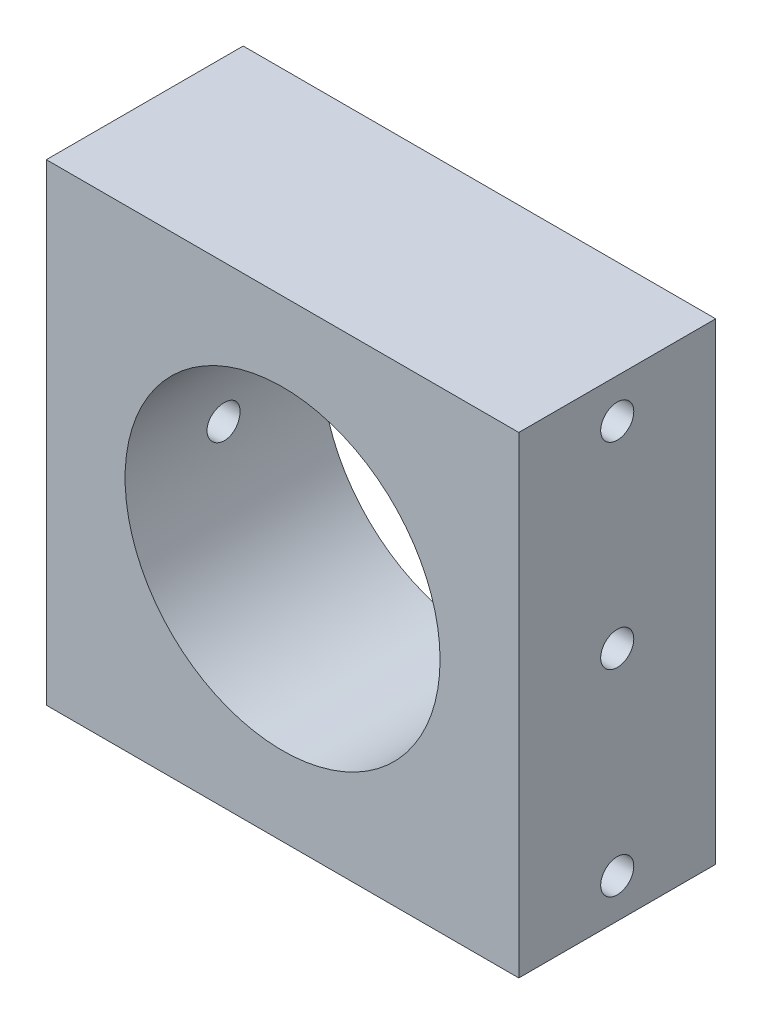
ISO-10303-21;
HEADER;
FILE_DESCRIPTION(('STEP AP214'),'2;1');
FILE_NAME('part.step','',(''),(''),'','','');
FILE_SCHEMA(('AUTOMOTIVE_DESIGN { 1 0 10303 214 1 1 1 1 }'));
ENDSEC;
DATA;
#1=APPLICATION_CONTEXT('core data for automotive mechanical design processes');
#2=APPLICATION_PROTOCOL_DEFINITION('international standard','automotive_design',2000,#1);
#3=PRODUCT_CONTEXT('',#1,'mechanical');
#4=PRODUCT('Part','Part','',(#3));
#5=PRODUCT_RELATED_PRODUCT_CATEGORY('part','',(#4));
#6=PRODUCT_DEFINITION_FORMATION('','',#4);
#7=PRODUCT_DEFINITION_CONTEXT('part definition',#1,'design');
#8=PRODUCT_DEFINITION('design','',#6,#7);
#9=PRODUCT_DEFINITION_SHAPE('','',#8);
#10=(LENGTH_UNIT() NAMED_UNIT(*) SI_UNIT(.MILLI.,.METRE.));
#11=(NAMED_UNIT(*) PLANE_ANGLE_UNIT() SI_UNIT($,.RADIAN.));
#12=(NAMED_UNIT(*) SI_UNIT($,.STERADIAN.) SOLID_ANGLE_UNIT());
#13=UNCERTAINTY_MEASURE_WITH_UNIT(LENGTH_MEASURE(1.E-05),#10,'distance_accuracy_value','');
#14=(GEOMETRIC_REPRESENTATION_CONTEXT(3) GLOBAL_UNCERTAINTY_ASSIGNED_CONTEXT((#13)) GLOBAL_UNIT_ASSIGNED_CONTEXT((#10,
#11,#12)) REPRESENTATION_CONTEXT('',''));
#15=CARTESIAN_POINT('',(0.,0.,0.));
#16=DIRECTION('',(0.,0.,1.));
#17=DIRECTION('',(1.,0.,0.));
#18=AXIS2_PLACEMENT_3D('',#15,#16,#17);
#19=CARTESIAN_POINT('',(0.,-30.,25.));
#20=DIRECTION('',(0.,1.,0.));
#21=DIRECTION('',(0.,0.,1.));
#22=AXIS2_PLACEMENT_3D('',#19,#20,#21);
#23=PLANE('',#22);
#24=DIRECTION('',(1.,0.,0.));
#25=VECTOR('',#24,1.);
#26=CARTESIAN_POINT('',(0.,-30.,0.));
#27=LINE('',#26,#25);
#28=CARTESIAN_POINT('',(-30.,-30.,0.));
#29=VERTEX_POINT('',#28);
#30=CARTESIAN_POINT('',(30.,-30.,0.));
#31=VERTEX_POINT('',#30);
#32=EDGE_CURVE('E118',#29,#31,#27,.T.);
#33=ORIENTED_EDGE('',*,*,#32,.T.);
#34=DIRECTION('',(0.,0.,-1.));
#35=VECTOR('',#34,1.);
#36=CARTESIAN_POINT('',(30.,-30.,25.));
#37=LINE('',#36,#35);
#38=CARTESIAN_POINT('',(30.,-30.,25.));
#39=VERTEX_POINT('',#38);
#40=EDGE_CURVE('E11',#39,#31,#37,.T.);
#41=ORIENTED_EDGE('',*,*,#40,.F.);
#42=DIRECTION('',(1.,0.,0.));
#43=VECTOR('',#42,1.);
#44=CARTESIAN_POINT('',(0.,-30.,25.));
#45=LINE('',#44,#43);
#46=CARTESIAN_POINT('',(-30.,-30.,25.));
#47=VERTEX_POINT('',#46);
#48=EDGE_CURVE('E100',#47,#39,#45,.T.);
#49=ORIENTED_EDGE('',*,*,#48,.F.);
#50=DIRECTION('',(0.,0.,-1.));
#51=VECTOR('',#50,1.);
#52=CARTESIAN_POINT('',(-30.,-30.,25.));
#53=LINE('',#52,#51);
#54=EDGE_CURVE('E66',#47,#29,#53,.T.);
#55=ORIENTED_EDGE('',*,*,#54,.T.);
#56=EDGE_LOOP('',(#33,#41,#49,#55));
#57=FACE_BOUND('',#56,.T.);
#58=ADVANCED_FACE('F43',(#57),#23,.F.);
#59=CARTESIAN_POINT('',(30.,0.,25.));
#60=DIRECTION('',(-1.,0.,0.));
#61=DIRECTION('',(0.,0.,1.));
#62=AXIS2_PLACEMENT_3D('',#59,#60,#61);
#63=PLANE('',#62);
#64=CARTESIAN_POINT('',(30.,25.,12.5));
#65=DIRECTION('',(1.,0.,0.));
#66=DIRECTION('',(0.,0.,-1.));
#67=AXIS2_PLACEMENT_3D('',#64,#65,#66);
#68=CIRCLE('',#67,2.1);
#69=CARTESIAN_POINT('',(30.,25.,10.4));
#70=VERTEX_POINT('',#69);
#71=EDGE_CURVE('E191',#70,#70,#68,.T.);
#72=ORIENTED_EDGE('',*,*,#71,.F.);
#73=EDGE_LOOP('',(#72));
#74=FACE_BOUND('',#73,.T.);
#75=CARTESIAN_POINT('',(30.,-25.,12.5));
#76=DIRECTION('',(1.,0.,0.));
#77=DIRECTION('',(0.,0.,-1.));
#78=AXIS2_PLACEMENT_3D('',#75,#76,#77);
#79=CIRCLE('',#78,2.1);
#80=CARTESIAN_POINT('',(30.,-25.,10.4));
#81=VERTEX_POINT('',#80);
#82=EDGE_CURVE('E188',#81,#81,#79,.T.);
#83=ORIENTED_EDGE('',*,*,#82,.F.);
#84=EDGE_LOOP('',(#83));
#85=FACE_BOUND('',#84,.T.);
#86=CARTESIAN_POINT('',(30.,0.,12.5));
#87=DIRECTION('',(1.,0.,0.));
#88=DIRECTION('',(0.,0.,-1.));
#89=AXIS2_PLACEMENT_3D('',#86,#87,#88);
#90=CIRCLE('',#89,2.1);
#91=CARTESIAN_POINT('',(30.,0.,10.4));
#92=VERTEX_POINT('',#91);
#93=EDGE_CURVE('E182',#92,#92,#90,.T.);
#94=ORIENTED_EDGE('',*,*,#93,.F.);
#95=EDGE_LOOP('',(#94));
#96=FACE_BOUND('',#95,.T.);
#97=DIRECTION('',(0.,1.,0.));
#98=VECTOR('',#97,1.);
#99=CARTESIAN_POINT('',(30.,0.,0.));
#100=LINE('',#99,#98);
#101=CARTESIAN_POINT('',(30.,30.,0.));
#102=VERTEX_POINT('',#101);
#103=EDGE_CURVE('E105',#31,#102,#100,.T.);
#104=ORIENTED_EDGE('',*,*,#103,.T.);
#105=DIRECTION('',(0.,0.,-1.));
#106=VECTOR('',#105,1.);
#107=CARTESIAN_POINT('',(30.,30.,25.));
#108=LINE('',#107,#106);
#109=CARTESIAN_POINT('',(30.,30.,25.));
#110=VERTEX_POINT('',#109);
#111=EDGE_CURVE('E57',#110,#102,#108,.T.);
#112=ORIENTED_EDGE('',*,*,#111,.F.);
#113=DIRECTION('',(0.,1.,0.));
#114=VECTOR('',#113,1.);
#115=CARTESIAN_POINT('',(30.,0.,25.));
#116=LINE('',#115,#114);
#117=EDGE_CURVE('E91',#39,#110,#116,.T.);
#118=ORIENTED_EDGE('',*,*,#117,.F.);
#119=ORIENTED_EDGE('',*,*,#40,.T.);
#120=EDGE_LOOP('',(#104,#112,#118,#119));
#121=FACE_BOUND('',#120,.T.);
#122=ADVANCED_FACE('F104',(#74,#85,#96,#121),#63,.F.);
#123=CARTESIAN_POINT('',(0.,30.,25.));
#124=DIRECTION('',(0.,1.,0.));
#125=DIRECTION('',(0.,0.,1.));
#126=AXIS2_PLACEMENT_3D('',#123,#124,#125);
#127=PLANE('',#126);
#128=DIRECTION('',(1.,0.,0.));
#129=VECTOR('',#128,1.);
#130=CARTESIAN_POINT('',(0.,30.,0.));
#131=LINE('',#130,#129);
#132=CARTESIAN_POINT('',(-30.,30.,0.));
#133=VERTEX_POINT('',#132);
#134=EDGE_CURVE('E121',#133,#102,#131,.T.);
#135=ORIENTED_EDGE('',*,*,#134,.F.);
#136=DIRECTION('',(0.,0.,-1.));
#137=VECTOR('',#136,1.);
#138=CARTESIAN_POINT('',(-30.,30.,25.));
#139=LINE('',#138,#137);
#140=CARTESIAN_POINT('',(-30.,30.,25.));
#141=VERTEX_POINT('',#140);
#142=EDGE_CURVE('E80',#141,#133,#139,.T.);
#143=ORIENTED_EDGE('',*,*,#142,.F.);
#144=DIRECTION('',(1.,0.,0.));
#145=VECTOR('',#144,1.);
#146=CARTESIAN_POINT('',(0.,30.,25.));
#147=LINE('',#146,#145);
#148=EDGE_CURVE('E99',#141,#110,#147,.T.);
#149=ORIENTED_EDGE('',*,*,#148,.T.);
#150=ORIENTED_EDGE('',*,*,#111,.T.);
#151=EDGE_LOOP('',(#135,#143,#149,#150));
#152=FACE_BOUND('',#151,.T.);
#153=ADVANCED_FACE('F109',(#152),#127,.T.);
#154=CARTESIAN_POINT('',(-30.,0.,25.));
#155=DIRECTION('',(-1.,0.,0.));
#156=DIRECTION('',(0.,0.,1.));
#157=AXIS2_PLACEMENT_3D('',#154,#155,#156);
#158=PLANE('',#157);
#159=CARTESIAN_POINT('',(-30.,25.,12.5));
#160=DIRECTION('',(1.,0.,0.));
#161=DIRECTION('',(0.,0.,-1.));
#162=AXIS2_PLACEMENT_3D('',#159,#160,#161);
#163=CIRCLE('',#162,2.1);
#164=CARTESIAN_POINT('',(-30.,25.,10.4));
#165=VERTEX_POINT('',#164);
#166=EDGE_CURVE('E135',#165,#165,#163,.T.);
#167=ORIENTED_EDGE('',*,*,#166,.T.);
#168=EDGE_LOOP('',(#167));
#169=FACE_BOUND('',#168,.T.);
#170=CARTESIAN_POINT('',(-30.,-25.,12.5));
#171=DIRECTION('',(1.,0.,0.));
#172=DIRECTION('',(0.,0.,-1.));
#173=AXIS2_PLACEMENT_3D('',#170,#171,#172);
#174=CIRCLE('',#173,2.1);
#175=CARTESIAN_POINT('',(-30.,-25.,10.4));
#176=VERTEX_POINT('',#175);
#177=EDGE_CURVE('E177',#176,#176,#174,.T.);
#178=ORIENTED_EDGE('',*,*,#177,.T.);
#179=EDGE_LOOP('',(#178));
#180=FACE_BOUND('',#179,.T.);
#181=CARTESIAN_POINT('',(-30.,0.,12.5));
#182=DIRECTION('',(1.,0.,0.));
#183=DIRECTION('',(0.,0.,-1.));
#184=AXIS2_PLACEMENT_3D('',#181,#182,#183);
#185=CIRCLE('',#184,2.1);
#186=CARTESIAN_POINT('',(-30.,0.,10.4));
#187=VERTEX_POINT('',#186);
#188=EDGE_CURVE('E180',#187,#187,#185,.T.);
#189=ORIENTED_EDGE('',*,*,#188,.T.);
#190=EDGE_LOOP('',(#189));
#191=FACE_BOUND('',#190,.T.);
#192=DIRECTION('',(0.,1.,0.));
#193=VECTOR('',#192,1.);
#194=CARTESIAN_POINT('',(-30.,0.,0.));
#195=LINE('',#194,#193);
#196=EDGE_CURVE('E123',#29,#133,#195,.T.);
#197=ORIENTED_EDGE('',*,*,#196,.F.);
#198=ORIENTED_EDGE('',*,*,#54,.F.);
#199=DIRECTION('',(0.,1.,0.));
#200=VECTOR('',#199,1.);
#201=CARTESIAN_POINT('',(-30.,0.,25.));
#202=LINE('',#201,#200);
#203=EDGE_CURVE('E110',#47,#141,#202,.T.);
#204=ORIENTED_EDGE('',*,*,#203,.T.);
#205=ORIENTED_EDGE('',*,*,#142,.T.);
#206=EDGE_LOOP('',(#197,#198,#204,#205));
#207=FACE_BOUND('',#206,.T.);
#208=ADVANCED_FACE('F163',(#169,#180,#191,#207),#158,.T.);
#209=CARTESIAN_POINT('',(0.,0.,25.));
#210=DIRECTION('',(0.,0.,-1.));
#211=DIRECTION('',(-1.,0.,0.));
#212=AXIS2_PLACEMENT_3D('',#209,#210,#211);
#213=CYLINDRICAL_SURFACE('',#212,20.);
#214=CARTESIAN_POINT('',(-20.,0.,14.6));
#215=CARTESIAN_POINT('',(-19.9999985861225,-0.117610574556953,14.5999949230642));
#216=CARTESIAN_POINT('',(-19.9989515701418,-0.235298131378431,14.5900865495256));
#217=CARTESIAN_POINT('',(-19.9948755007952,-0.467408281963046,14.5507109273298));
#218=CARTESIAN_POINT('',(-19.9918442846137,-0.581827170618682,14.52122233536));
#219=CARTESIAN_POINT('',(-19.9841418596598,-0.804005356961038,14.4435561221623));
#220=CARTESIAN_POINT('',(-19.9794716623513,-0.911768713849171,14.3953900254574));
#221=CARTESIAN_POINT('',(-19.9690129744413,-1.11765859904565,14.2817589762977));
#222=CARTESIAN_POINT('',(-19.963224700667,-1.2157869902952,14.2162973770353));
#223=CARTESIAN_POINT('',(-19.9511523144023,-1.40003175469819,14.069656435472));
#224=CARTESIAN_POINT('',(-19.9448665314529,-1.48610471828674,13.9884226842205));
#225=CARTESIAN_POINT('',(-19.9325213225088,-1.64342207671848,13.8126596136441));
#226=CARTESIAN_POINT('',(-19.9264619071801,-1.71466577354684,13.7181296688172));
#227=CARTESIAN_POINT('',(-19.915238578931,-1.84045763756347,13.5181837270879));
#228=CARTESIAN_POINT('',(-19.9100768004705,-1.89496624010398,13.4127427088117));
#229=CARTESIAN_POINT('',(-19.9012541874175,-1.98548798456523,13.1941409242799));
#230=CARTESIAN_POINT('',(-19.8975933121633,-2.02150162754854,13.080980367255));
#231=CARTESIAN_POINT('',(-19.8922022962288,-2.07388179744854,12.8505961431444));
#232=CARTESIAN_POINT('',(-19.890465054272,-2.09032060381389,12.7333890784955));
#233=CARTESIAN_POINT('',(-19.889096025595,-2.10330793490494,12.4978676604021));
#234=CARTESIAN_POINT('',(-19.8894641782095,-2.09985703273741,12.3795533389603));
#235=CARTESIAN_POINT('',(-19.8922578534938,-2.07322243378021,12.1456751550686));
#236=CARTESIAN_POINT('',(-19.8946751346228,-2.05011778256067,12.0301021784106));
#237=CARTESIAN_POINT('',(-19.9012818323377,-1.98495459652899,11.8044833478823));
#238=CARTESIAN_POINT('',(-19.9054712750661,-1.94289578210746,11.6944375755754));
#239=CARTESIAN_POINT('',(-19.9151597133921,-1.84093133329277,11.48274800286));
#240=CARTESIAN_POINT('',(-19.9206612683861,-1.78099076082822,11.3811211529613));
#241=CARTESIAN_POINT('',(-19.9323519192806,-1.64498937257378,11.1893397702597));
#242=CARTESIAN_POINT('',(-19.9385410373735,-1.56892803638548,11.0991856079598));
#243=CARTESIAN_POINT('',(-19.9509461711086,-1.40240335664829,10.9324495098156));
#244=CARTESIAN_POINT('',(-19.9571621711797,-1.31187177127052,10.8559357115762));
#245=CARTESIAN_POINT('',(-19.968892312137,-1.11921304858704,10.7191808453474));
#246=CARTESIAN_POINT('',(-19.9744064521085,-1.01708589617182,10.6589397985622));
#247=CARTESIAN_POINT('',(-19.9841136624366,-0.804086871738415,10.5564426844708));
#248=CARTESIAN_POINT('',(-19.9883064679749,-0.693213252337617,10.514190221792));
#249=CARTESIAN_POINT('',(-19.9948959572163,-0.465891500761026,10.4489203604243));
#250=CARTESIAN_POINT('',(-19.9972927001549,-0.349443552565791,10.4259023273658));
#251=CARTESIAN_POINT('',(-20.0000123913183,-0.114868577013525,10.39984150458));
#252=CARTESIAN_POINT('',(-20.0003450977805,0.00324789921030634,10.3967047198591));
#253=CARTESIAN_POINT('',(-19.9989254280681,0.238324864201357,10.4102483450366));
#254=CARTESIAN_POINT('',(-19.997173083004,0.355285370190177,10.4269284592536));
#255=CARTESIAN_POINT('',(-19.9917864257121,0.584457914380878,10.4795543943113));
#256=CARTESIAN_POINT('',(-19.9881564277171,0.696680202830055,10.5154560569179));
#257=CARTESIAN_POINT('',(-19.9794215373593,0.91350972665413,10.6054604957932));
#258=CARTESIAN_POINT('',(-19.9743166087398,1.01811677475236,10.6595637194972));
#259=CARTESIAN_POINT('',(-19.9631781959612,1.21717044721087,10.784667555895));
#260=CARTESIAN_POINT('',(-19.9571413566862,1.31157817667962,10.8557297509654));
#261=CARTESIAN_POINT('',(-19.9448268762315,1.48715924360521,11.0126462530323));
#262=CARTESIAN_POINT('',(-19.9385492283796,1.56833221403401,11.0985009701211));
#263=CARTESIAN_POINT('',(-19.9264311606194,1.71546723142883,11.2829762753991));
#264=CARTESIAN_POINT('',(-19.9205925796686,1.78136747427046,11.3816462956563));
#265=CARTESIAN_POINT('',(-19.9100421218507,1.8956611208723,11.5887082401009));
#266=CARTESIAN_POINT('',(-19.9053302282213,1.94405478509178,11.6971000196201));
#267=CARTESIAN_POINT('',(-19.8975783355781,2.02185870687172,11.9203189781473));
#268=CARTESIAN_POINT('',(-19.8945351306546,2.0513053846878,12.0351333467435));
#269=CARTESIAN_POINT('',(-19.8904553699829,2.09049747040514,12.2681105197299));
#270=CARTESIAN_POINT('',(-19.8894187502379,2.10024350662608,12.3862732172086));
#271=CARTESIAN_POINT('',(-19.8894709750246,2.09974842606066,12.6219784686339));
#272=CARTESIAN_POINT('',(-19.8905494954156,2.08960439407621,12.7395212407998));
#273=CARTESIAN_POINT('',(-19.8946884320046,2.04982105883557,12.9712226791796));
#274=CARTESIAN_POINT('',(-19.8977488501174,2.02018173674434,13.0853813421239));
#275=CARTESIAN_POINT('',(-19.9055038265572,1.94227663661315,13.3070710411124));
#276=CARTESIAN_POINT('',(-19.9101981047892,1.8940140510329,13.4146032094297));
#277=CARTESIAN_POINT('',(-19.9206924240923,1.78024229516215,13.6200565415963));
#278=CARTESIAN_POINT('',(-19.9264924626736,1.71473316370626,13.7179777270863));
#279=CARTESIAN_POINT('',(-19.9385787157003,1.56796388588165,13.9019269252103));
#280=CARTESIAN_POINT('',(-19.9448670815623,1.4866313492115,13.9878970396921));
#281=CARTESIAN_POINT('',(-19.9572018929493,1.3106694114521,14.1450103088069));
#282=CARTESIAN_POINT('',(-19.9632482803496,1.21603683994904,14.216149918128));
#283=CARTESIAN_POINT('',(-19.9744353744075,1.01587362585845,14.3417393164675));
#284=CARTESIAN_POINT('',(-19.9795735493958,0.910313780947585,14.396142755599));
#285=CARTESIAN_POINT('',(-19.9883382268767,0.691568973167297,14.4863785506049));
#286=CARTESIAN_POINT('',(-19.9919664216766,0.578392712609077,14.5222317076953));
#287=CARTESIAN_POINT('',(-19.9963973899638,0.387154461046656,14.5654739129788));
#288=CARTESIAN_POINT('',(-19.9977420180587,0.310312187595179,14.5784033405654));
#289=CARTESIAN_POINT('',(-19.9995437889269,0.155657848500259,14.5956680442412));
#290=CARTESIAN_POINT('',(-20.0000009358377,0.0778457873796139,14.6000033603957));
#291=CARTESIAN_POINT('',(-20.,0.,14.6));
#292=B_SPLINE_CURVE_WITH_KNOTS('',3,(#214,#215,#216,#217,#218,#219,#220,#221,#222,#223,#224,
#225,#226,#227,#228,#229,#230,#231,#232,#233,#234,#235,#236,#237,#238,#239,#240,#241,#242,#243,
#244,#245,#246,#247,#248,#249,#250,#251,#252,#253,#254,#255,#256,#257,#258,#259,#260,#261,#262,
#263,#264,#265,#266,#267,#268,#269,#270,#271,#272,#273,#274,#275,#276,#277,#278,#279,#280,#281,
#282,#283,#284,#285,#286,#287,#288,#289,#290,#291),.UNSPECIFIED.,.T.,.F.,(4,2,2,2,2,2,2,2,2,2,2,
2,2,2,2,2,2,2,2,2,2,2,2,2,2,2,2,2,2,2,2,2,2,2,2,2,2,2,4),(0.,0.352547445376477,
0.705479815473272,1.05819476242917,1.41084137634127,1.76472684686617,2.11862897104477,
2.47336144998344,2.82808431805778,3.18149328120567,3.53489206119519,3.8868761877292,
4.2388655068582,4.59154711145463,4.94424010278876,5.29864833369556,5.65305702641607,
6.00753670363999,6.36200468932826,6.71479555573139,7.06758115832308,7.41955975201312,
7.7715469987624,8.12483238904231,8.47812757501263,8.8328284043015,9.18752395620733,
9.54153565252774,9.89553605804705,10.2478128639807,10.6000900102609,10.9523067948682,
11.3045227863845,11.6583897165679,12.0123411437847,12.3672641737055,12.7217883461217,
12.955138633902,13.1884878338135),.UNSPECIFIED.);
#293=CARTESIAN_POINT('',(-20.,0.,14.6));
#294=VERTEX_POINT('',#293);
#295=EDGE_CURVE('E46',#294,#294,#292,.T.);
#296=ORIENTED_EDGE('',*,*,#295,.F.);
#297=EDGE_LOOP('',(#296));
#298=FACE_BOUND('',#297,.T.);
#299=CARTESIAN_POINT('',(20.,0.,10.4));
#300=CARTESIAN_POINT('',(19.9999985861225,-0.117610574556953,10.4000050769358));
#301=CARTESIAN_POINT('',(19.9989515701418,-0.235298131378431,10.4099134504744));
#302=CARTESIAN_POINT('',(19.9948755007952,-0.467408281963046,10.4492890726702));
#303=CARTESIAN_POINT('',(19.9918442846137,-0.581827170618682,10.47877766464));
#304=CARTESIAN_POINT('',(19.9841418596598,-0.804005356961037,10.5564438778377));
#305=CARTESIAN_POINT('',(19.9794716623513,-0.911768713849169,10.6046099745426));
#306=CARTESIAN_POINT('',(19.9690129744413,-1.11765859904565,10.7182410237023));
#307=CARTESIAN_POINT('',(19.963224700667,-1.2157869902952,10.7837026229647));
#308=CARTESIAN_POINT('',(19.9511523144023,-1.40003175469819,10.930343564528));
#309=CARTESIAN_POINT('',(19.9448665314529,-1.48610471828674,11.0115773157795));
#310=CARTESIAN_POINT('',(19.9325213225088,-1.64342207671848,11.1873403863559));
#311=CARTESIAN_POINT('',(19.9264619071801,-1.71466577354684,11.2818703311828));
#312=CARTESIAN_POINT('',(19.915238578931,-1.84045763756347,11.4818162729121));
#313=CARTESIAN_POINT('',(19.9100768004705,-1.89496624010398,11.5872572911883));
#314=CARTESIAN_POINT('',(19.9012541874175,-1.98548798456523,11.8058590757201));
#315=CARTESIAN_POINT('',(19.8975933121633,-2.02150162754854,11.919019632745));
#316=CARTESIAN_POINT('',(19.8922022962288,-2.07388179744854,12.1494038568556));
#317=CARTESIAN_POINT('',(19.890465054272,-2.09032060381389,12.2666109215045));
#318=CARTESIAN_POINT('',(19.889096025595,-2.10330793490494,12.5021323395979));
#319=CARTESIAN_POINT('',(19.8894641782095,-2.09985703273741,12.6204466610397));
#320=CARTESIAN_POINT('',(19.8922578534938,-2.07322243378021,12.8543248449314));
#321=CARTESIAN_POINT('',(19.8946751346228,-2.05011778256067,12.9698978215894));
#322=CARTESIAN_POINT('',(19.9012818323377,-1.98495459652899,13.1955166521177));
#323=CARTESIAN_POINT('',(19.9054712750661,-1.94289578210746,13.3055624244246));
#324=CARTESIAN_POINT('',(19.9151597133921,-1.84093133329277,13.51725199714));
#325=CARTESIAN_POINT('',(19.9206612683861,-1.78099076082822,13.6188788470387));
#326=CARTESIAN_POINT('',(19.9323519192806,-1.64498937257378,13.8106602297403));
#327=CARTESIAN_POINT('',(19.9385410373735,-1.56892803638547,13.9008143920402));
#328=CARTESIAN_POINT('',(19.9509461711086,-1.40240335664829,14.0675504901844));
#329=CARTESIAN_POINT('',(19.9571621711797,-1.31187177127052,14.1440642884238));
#330=CARTESIAN_POINT('',(19.968892312137,-1.11921304858704,14.2808191546526));
#331=CARTESIAN_POINT('',(19.9744064521085,-1.01708589617182,14.3410602014378));
#332=CARTESIAN_POINT('',(19.9841136624366,-0.804086871738416,14.4435573155292));
#333=CARTESIAN_POINT('',(19.9883064679749,-0.693213252337618,14.485809778208));
#334=CARTESIAN_POINT('',(19.9948959572163,-0.465891500761026,14.5510796395757));
#335=CARTESIAN_POINT('',(19.9972927001549,-0.349443552565791,14.5740976726342));
#336=CARTESIAN_POINT('',(20.0000123913183,-0.114868577013525,14.60015849542));
#337=CARTESIAN_POINT('',(20.0003450977805,0.0032478992103063,14.6032952801409));
#338=CARTESIAN_POINT('',(19.9989254280681,0.238324864201357,14.5897516549634));
#339=CARTESIAN_POINT('',(19.997173083004,0.355285370190177,14.5730715407464));
#340=CARTESIAN_POINT('',(19.9917864257121,0.584457914380878,14.5204456056887));
#341=CARTESIAN_POINT('',(19.9881564277171,0.696680202830054,14.4845439430821));
#342=CARTESIAN_POINT('',(19.9794215373593,0.913509726654129,14.3945395042068));
#343=CARTESIAN_POINT('',(19.9743166087398,1.01811677475236,14.3404362805028));
#344=CARTESIAN_POINT('',(19.9631781959612,1.21717044721087,14.215332444105));
#345=CARTESIAN_POINT('',(19.9571413566862,1.31157817667962,14.1442702490346));
#346=CARTESIAN_POINT('',(19.9448268762315,1.48715924360521,13.9873537469677));
#347=CARTESIAN_POINT('',(19.9385492283796,1.56833221403401,13.9014990298789));
#348=CARTESIAN_POINT('',(19.9264311606194,1.71546723142883,13.7170237246009));
#349=CARTESIAN_POINT('',(19.9205925796686,1.78136747427046,13.6183537043437));
#350=CARTESIAN_POINT('',(19.9100421218507,1.8956611208723,13.4112917598991));
#351=CARTESIAN_POINT('',(19.9053302282213,1.94405478509178,13.3028999803799));
#352=CARTESIAN_POINT('',(19.8975783355781,2.02185870687172,13.0796810218527));
#353=CARTESIAN_POINT('',(19.8945351306546,2.0513053846878,12.9648666532565));
#354=CARTESIAN_POINT('',(19.8904553699829,2.09049747040514,12.7318894802701));
#355=CARTESIAN_POINT('',(19.8894187502379,2.10024350662608,12.6137267827914));
#356=CARTESIAN_POINT('',(19.8894709750246,2.09974842606066,12.3780215313661));
#357=CARTESIAN_POINT('',(19.8905494954156,2.08960439407621,12.2604787592002));
#358=CARTESIAN_POINT('',(19.8946884320046,2.04982105883557,12.0287773208204));
#359=CARTESIAN_POINT('',(19.8977488501174,2.02018173674434,11.9146186578761));
#360=CARTESIAN_POINT('',(19.9055038265572,1.94227663661315,11.6929289588876));
#361=CARTESIAN_POINT('',(19.9101981047892,1.8940140510329,11.5853967905703));
#362=CARTESIAN_POINT('',(19.9206924240923,1.78024229516215,11.3799434584037));
#363=CARTESIAN_POINT('',(19.9264924626736,1.71473316370626,11.2820222729137));
#364=CARTESIAN_POINT('',(19.9385787157003,1.56796388588165,11.0980730747897));
#365=CARTESIAN_POINT('',(19.9448670815623,1.4866313492115,11.0121029603079));
#366=CARTESIAN_POINT('',(19.9572018929493,1.3106694114521,10.8549896911931));
#367=CARTESIAN_POINT('',(19.9632482803496,1.21603683994904,10.783850081872));
#368=CARTESIAN_POINT('',(19.9744353744075,1.01587362585845,10.6582606835325));
#369=CARTESIAN_POINT('',(19.9795735493958,0.910313780947585,10.603857244401));
#370=CARTESIAN_POINT('',(19.9883382268767,0.691568973167297,10.5136214493951));
#371=CARTESIAN_POINT('',(19.9919664216766,0.578392712609078,10.4777682923047));
#372=CARTESIAN_POINT('',(19.9963973899638,0.387154461046656,10.4345260870212));
#373=CARTESIAN_POINT('',(19.9977420180587,0.310312187595179,10.4215966594346));
#374=CARTESIAN_POINT('',(19.9995437889269,0.155657848500259,10.4043319557588));
#375=CARTESIAN_POINT('',(20.0000009358377,0.0778457873796139,10.3999966396043));
#376=CARTESIAN_POINT('',(20.,0.,10.4));
#377=B_SPLINE_CURVE_WITH_KNOTS('',3,(#299,#300,#301,#302,#303,#304,#305,#306,#307,#308,#309,
#310,#311,#312,#313,#314,#315,#316,#317,#318,#319,#320,#321,#322,#323,#324,#325,#326,#327,#328,
#329,#330,#331,#332,#333,#334,#335,#336,#337,#338,#339,#340,#341,#342,#343,#344,#345,#346,#347,
#348,#349,#350,#351,#352,#353,#354,#355,#356,#357,#358,#359,#360,#361,#362,#363,#364,#365,#366,
#367,#368,#369,#370,#371,#372,#373,#374,#375,#376),.UNSPECIFIED.,.T.,.F.,(4,2,2,2,2,2,2,2,2,2,2,
2,2,2,2,2,2,2,2,2,2,2,2,2,2,2,2,2,2,2,2,2,2,2,2,2,2,2,4),(0.,0.352547445376477,
0.705479815473272,1.05819476242917,1.41084137634127,1.76472684686617,2.11862897104477,
2.47336144998344,2.82808431805778,3.18149328120567,3.53489206119519,3.8868761877292,
4.2388655068582,4.59154711145464,4.94424010278876,5.29864833369556,5.65305702641607,
6.00753670363999,6.36200468932826,6.71479555573139,7.06758115832308,7.41955975201312,
7.7715469987624,8.12483238904231,8.47812757501264,8.8328284043015,9.18752395620733,
9.54153565252774,9.89553605804705,10.2478128639807,10.6000900102609,10.9523067948682,
11.3045227863845,11.6583897165679,12.0123411437847,12.3672641737055,12.7217883461217,
12.9551386339019,13.1884878338135),.UNSPECIFIED.);
#378=CARTESIAN_POINT('',(20.,0.,10.4));
#379=VERTEX_POINT('',#378);
#380=EDGE_CURVE('E130',#379,#379,#377,.T.);
#381=ORIENTED_EDGE('',*,*,#380,.F.);
#382=EDGE_LOOP('',(#381));
#383=FACE_BOUND('',#382,.T.);
#384=CARTESIAN_POINT('',(0.,0.,25.));
#385=DIRECTION('',(0.,0.,1.));
#386=DIRECTION('',(1.,0.,0.));
#387=AXIS2_PLACEMENT_3D('',#384,#385,#386);
#388=CIRCLE('',#387,20.);
#389=CARTESIAN_POINT('',(20.,0.,25.));
#390=VERTEX_POINT('',#389);
#391=EDGE_CURVE('E112',#390,#390,#388,.T.);
#392=ORIENTED_EDGE('',*,*,#391,.T.);
#393=EDGE_LOOP('',(#392));
#394=FACE_BOUND('',#393,.T.);
#395=CARTESIAN_POINT('',(0.,0.,0.));
#396=DIRECTION('',(0.,0.,1.));
#397=DIRECTION('',(1.,0.,0.));
#398=AXIS2_PLACEMENT_3D('',#395,#396,#397);
#399=CIRCLE('',#398,20.);
#400=CARTESIAN_POINT('',(20.,0.,0.));
#401=VERTEX_POINT('',#400);
#402=EDGE_CURVE('E126',#401,#401,#399,.T.);
#403=ORIENTED_EDGE('',*,*,#402,.F.);
#404=EDGE_LOOP('',(#403));
#405=FACE_BOUND('',#404,.T.);
#406=ADVANCED_FACE('F136',(#298,#383,#394,#405),#213,.F.);
#407=CARTESIAN_POINT('',(0.,0.,25.));
#408=DIRECTION('',(0.,0.,1.));
#409=DIRECTION('',(1.,0.,0.));
#410=AXIS2_PLACEMENT_3D('',#407,#408,#409);
#411=PLANE('',#410);
#412=ORIENTED_EDGE('',*,*,#48,.T.);
#413=ORIENTED_EDGE('',*,*,#117,.T.);
#414=ORIENTED_EDGE('',*,*,#148,.F.);
#415=ORIENTED_EDGE('',*,*,#203,.F.);
#416=EDGE_LOOP('',(#412,#413,#414,#415));
#417=FACE_BOUND('',#416,.T.);
#418=ORIENTED_EDGE('',*,*,#391,.F.);
#419=EDGE_LOOP('',(#418));
#420=FACE_BOUND('',#419,.T.);
#421=ADVANCED_FACE('F95',(#417,#420),#411,.T.);
#422=CARTESIAN_POINT('',(0.,0.,0.));
#423=DIRECTION('',(0.,0.,1.));
#424=DIRECTION('',(1.,0.,0.));
#425=AXIS2_PLACEMENT_3D('',#422,#423,#424);
#426=PLANE('',#425);
#427=ORIENTED_EDGE('',*,*,#32,.F.);
#428=ORIENTED_EDGE('',*,*,#196,.T.);
#429=ORIENTED_EDGE('',*,*,#134,.T.);
#430=ORIENTED_EDGE('',*,*,#103,.F.);
#431=EDGE_LOOP('',(#427,#428,#429,#430));
#432=FACE_BOUND('',#431,.T.);
#433=ORIENTED_EDGE('',*,*,#402,.T.);
#434=EDGE_LOOP('',(#433));
#435=FACE_BOUND('',#434,.T.);
#436=ADVANCED_FACE('F146',(#432,#435),#426,.F.);
#437=CARTESIAN_POINT('',(-30.,0.,12.5));
#438=DIRECTION('',(1.,0.,0.));
#439=DIRECTION('',(0.,0.,-1.));
#440=AXIS2_PLACEMENT_3D('',#437,#438,#439);
#441=CYLINDRICAL_SURFACE('',#440,2.1);
#442=ORIENTED_EDGE('',*,*,#380,.T.);
#443=EDGE_LOOP('',(#442));
#444=FACE_BOUND('',#443,.T.);
#445=ORIENTED_EDGE('',*,*,#93,.T.);
#446=EDGE_LOOP('',(#445));
#447=FACE_BOUND('',#446,.T.);
#448=ADVANCED_FACE('F140',(#444,#447),#441,.F.);
#449=ORIENTED_EDGE('',*,*,#295,.T.);
#450=EDGE_LOOP('',(#449));
#451=FACE_BOUND('',#450,.T.);
#452=ORIENTED_EDGE('',*,*,#188,.F.);
#453=EDGE_LOOP('',(#452));
#454=FACE_BOUND('',#453,.T.);
#455=ADVANCED_FACE('F145',(#451,#454),#441,.F.);
#456=CARTESIAN_POINT('',(-30.,-25.,12.5));
#457=DIRECTION('',(1.,0.,0.));
#458=DIRECTION('',(0.,0.,-1.));
#459=AXIS2_PLACEMENT_3D('',#456,#457,#458);
#460=CYLINDRICAL_SURFACE('',#459,2.1);
#461=ORIENTED_EDGE('',*,*,#177,.F.);
#462=EDGE_LOOP('',(#461));
#463=FACE_BOUND('',#462,.T.);
#464=ORIENTED_EDGE('',*,*,#82,.T.);
#465=EDGE_LOOP('',(#464));
#466=FACE_BOUND('',#465,.T.);
#467=ADVANCED_FACE('F148',(#463,#466),#460,.F.);
#468=CARTESIAN_POINT('',(-30.,25.,12.5));
#469=DIRECTION('',(1.,0.,0.));
#470=DIRECTION('',(0.,0.,-1.));
#471=AXIS2_PLACEMENT_3D('',#468,#469,#470);
#472=CYLINDRICAL_SURFACE('',#471,2.1);
#473=ORIENTED_EDGE('',*,*,#166,.F.);
#474=EDGE_LOOP('',(#473));
#475=FACE_BOUND('',#474,.T.);
#476=ORIENTED_EDGE('',*,*,#71,.T.);
#477=EDGE_LOOP('',(#476));
#478=FACE_BOUND('',#477,.T.);
#479=ADVANCED_FACE('F196',(#475,#478),#472,.F.);
#480=CLOSED_SHELL('',(#58,#122,#153,#208,#406,#421,#436,#448,#455,#467,#479));
#481=MANIFOLD_SOLID_BREP('B2',#480);
#482=ADVANCED_BREP_SHAPE_REPRESENTATION('',(#18,#481),#14);
#483=SHAPE_DEFINITION_REPRESENTATION(#9,#482);
ENDSEC;
END-ISO-10303-21;
